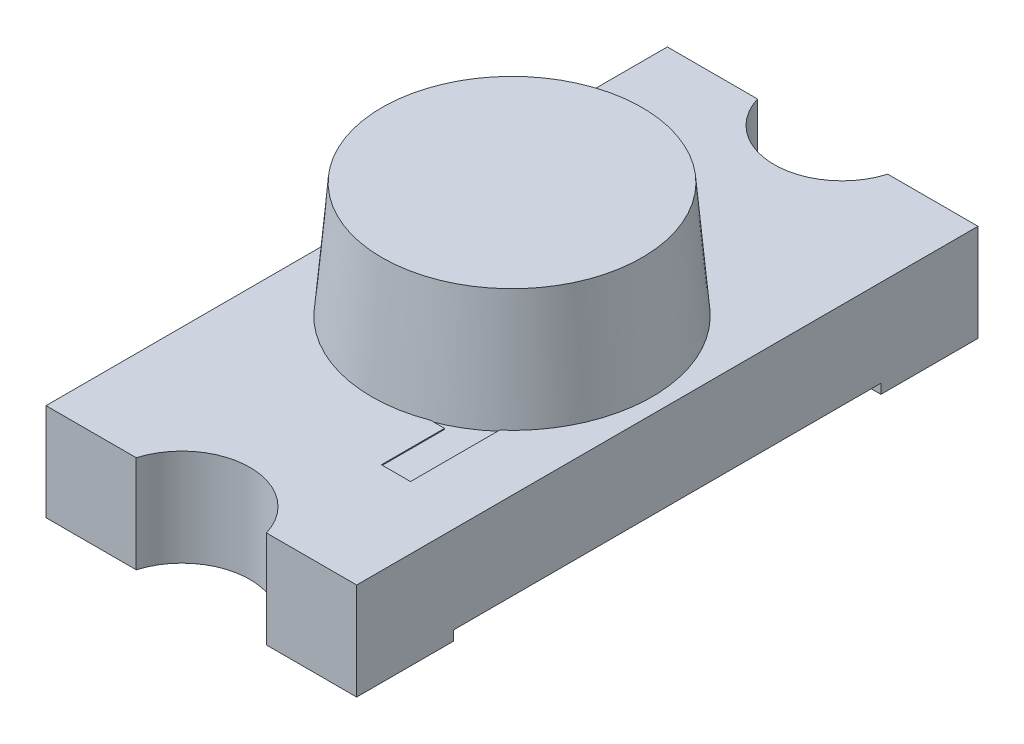
ISO-10303-21;
HEADER;
FILE_DESCRIPTION(('STEP AP214'),'2;1');
FILE_NAME('part.step','',(''),(''),'','','');
FILE_SCHEMA(('AUTOMOTIVE_DESIGN { 1 0 10303 214 1 1 1 1 }'));
ENDSEC;
DATA;
#1=APPLICATION_CONTEXT('core data for automotive mechanical design processes');
#2=APPLICATION_PROTOCOL_DEFINITION('international standard','automotive_design',2000,#1);
#3=PRODUCT_CONTEXT('',#1,'mechanical');
#4=PRODUCT('Part','Part','',(#3));
#5=PRODUCT_RELATED_PRODUCT_CATEGORY('part','',(#4));
#6=PRODUCT_DEFINITION_FORMATION('','',#4);
#7=PRODUCT_DEFINITION_CONTEXT('part definition',#1,'design');
#8=PRODUCT_DEFINITION('design','',#6,#7);
#9=PRODUCT_DEFINITION_SHAPE('','',#8);
#10=(LENGTH_UNIT() NAMED_UNIT(*) SI_UNIT(.MILLI.,.METRE.));
#11=(NAMED_UNIT(*) PLANE_ANGLE_UNIT() SI_UNIT($,.RADIAN.));
#12=(NAMED_UNIT(*) SI_UNIT($,.STERADIAN.) SOLID_ANGLE_UNIT());
#13=UNCERTAINTY_MEASURE_WITH_UNIT(LENGTH_MEASURE(1.E-05),#10,'distance_accuracy_value','');
#14=(GEOMETRIC_REPRESENTATION_CONTEXT(3) GLOBAL_UNCERTAINTY_ASSIGNED_CONTEXT((#13)) GLOBAL_UNIT_ASSIGNED_CONTEXT((#10,
#11,#12)) REPRESENTATION_CONTEXT('',''));
#15=CARTESIAN_POINT('',(0.,0.,0.));
#16=DIRECTION('',(0.,0.,1.));
#17=DIRECTION('',(1.,0.,0.));
#18=AXIS2_PLACEMENT_3D('',#15,#16,#17);
#19=CARTESIAN_POINT('',(0.,0.495,0.));
#20=DIRECTION('',(0.,-1.,0.));
#21=DIRECTION('',(0.,0.,1.));
#22=AXIS2_PLACEMENT_3D('',#19,#20,#21);
#23=CONICAL_SURFACE('',#22,0.722303878658216,0.0872664625997167);
#24=CARTESIAN_POINT('',(0.,1.095,0.));
#25=DIRECTION('',(0.,1.,0.));
#26=DIRECTION('',(0.,0.,1.));
#27=AXIS2_PLACEMENT_3D('',#24,#25,#26);
#28=CIRCLE('',#27,0.669810680542662);
#29=CARTESIAN_POINT('',(0.,1.095,0.669810680542662));
#30=VERTEX_POINT('',#29);
#31=EDGE_CURVE('E12',#30,#30,#28,.T.);
#32=ORIENTED_EDGE('',*,*,#31,.F.);
#33=EDGE_LOOP('',(#32));
#34=FACE_BOUND('',#33,.T.);
#35=CARTESIAN_POINT('',(0.,0.495,0.));
#36=DIRECTION('',(0.,1.,0.));
#37=DIRECTION('',(0.,0.,1.));
#38=AXIS2_PLACEMENT_3D('',#35,#36,#37);
#39=CIRCLE('',#38,0.722303878658216);
#40=CARTESIAN_POINT('',(0.,0.495,0.722303878658216));
#41=VERTEX_POINT('',#40);
#42=EDGE_CURVE('E52',#41,#41,#39,.T.);
#43=ORIENTED_EDGE('',*,*,#42,.T.);
#44=EDGE_LOOP('',(#43));
#45=FACE_BOUND('',#44,.T.);
#46=ADVANCED_FACE('F46',(#34,#45),#23,.T.);
#47=CARTESIAN_POINT('',(0.,1.095,0.));
#48=DIRECTION('',(0.,1.,0.));
#49=DIRECTION('',(0.,0.,1.));
#50=AXIS2_PLACEMENT_3D('',#47,#48,#49);
#51=PLANE('',#50);
#52=ORIENTED_EDGE('',*,*,#31,.T.);
#53=EDGE_LOOP('',(#52));
#54=FACE_BOUND('',#53,.T.);
#55=ADVANCED_FACE('F61',(#54),#51,.T.);
#56=CARTESIAN_POINT('',(0.,0.495,0.));
#57=DIRECTION('',(0.,1.,0.));
#58=DIRECTION('',(0.,0.,1.));
#59=AXIS2_PLACEMENT_3D('',#56,#57,#58);
#60=PLANE('',#59);
#61=ORIENTED_EDGE('',*,*,#42,.F.);
#62=EDGE_LOOP('',(#61));
#63=FACE_BOUND('',#62,.T.);
#64=ADVANCED_FACE('F59',(#63),#60,.F.);
#65=CLOSED_SHELL('',(#46,#55,#64));
#66=MANIFOLD_SOLID_BREP('B2',#65);
#67=CARTESIAN_POINT('',(-2.92422569718548,0.495,0.));
#68=DIRECTION('',(0.,1.,0.));
#69=DIRECTION('',(0.,0.,1.));
#70=AXIS2_PLACEMENT_3D('',#67,#68,#69);
#71=PLANE('',#70);
#72=DIRECTION('',(0.,0.,1.));
#73=VECTOR('',#72,1.);
#74=CARTESIAN_POINT('',(0.477379024541812,0.495,0.));
#75=LINE('',#74,#73);
#76=CARTESIAN_POINT('',(0.477379024541812,0.495,0.525));
#77=VERTEX_POINT('',#76);
#78=CARTESIAN_POINT('',(0.477379024541812,0.495,1.));
#79=VERTEX_POINT('',#78);
#80=EDGE_CURVE('E368',#77,#79,#75,.T.);
#81=ORIENTED_EDGE('',*,*,#80,.F.);
#82=DIRECTION('',(1.,0.,0.));
#83=VECTOR('',#82,1.);
#84=CARTESIAN_POINT('',(-2.92422569718548,0.495,0.525));
#85=LINE('',#84,#83);
#86=CARTESIAN_POINT('',(-0.075,0.495,0.525));
#87=VERTEX_POINT('',#86);
#88=EDGE_CURVE('E370',#87,#77,#85,.T.);
#89=ORIENTED_EDGE('',*,*,#88,.F.);
#90=DIRECTION('',(0.,0.,1.));
#91=VECTOR('',#90,1.);
#92=CARTESIAN_POINT('',(-0.075,0.495,0.));
#93=LINE('',#92,#91);
#94=CARTESIAN_POINT('',(-0.075,0.495,0.225));
#95=VERTEX_POINT('',#94);
#96=EDGE_CURVE('E373',#95,#87,#93,.T.);
#97=ORIENTED_EDGE('',*,*,#96,.F.);
#98=DIRECTION('',(1.,0.,0.));
#99=VECTOR('',#98,1.);
#100=CARTESIAN_POINT('',(-2.92422569718548,0.495,0.225000000000001));
#101=LINE('',#100,#99);
#102=CARTESIAN_POINT('',(0.225,0.495,0.225));
#103=VERTEX_POINT('',#102);
#104=EDGE_CURVE('E375',#95,#103,#101,.T.);
#105=ORIENTED_EDGE('',*,*,#104,.T.);
#106=DIRECTION('',(0.,0.,1.));
#107=VECTOR('',#106,1.);
#108=CARTESIAN_POINT('',(0.225,0.495,0.));
#109=LINE('',#108,#107);
#110=CARTESIAN_POINT('',(0.225,0.495,-0.225));
#111=VERTEX_POINT('',#110);
#112=EDGE_CURVE('E378',#111,#103,#109,.T.);
#113=ORIENTED_EDGE('',*,*,#112,.F.);
#114=DIRECTION('',(1.,0.,0.));
#115=VECTOR('',#114,1.);
#116=CARTESIAN_POINT('',(-2.92422569718548,0.495,-0.225));
#117=LINE('',#116,#115);
#118=CARTESIAN_POINT('',(-0.225,0.495,-0.225));
#119=VERTEX_POINT('',#118);
#120=EDGE_CURVE('E380',#119,#111,#117,.T.);
#121=ORIENTED_EDGE('',*,*,#120,.F.);
#122=DIRECTION('',(0.,0.,1.));
#123=VECTOR('',#122,1.);
#124=CARTESIAN_POINT('',(-0.225,0.495,0.));
#125=LINE('',#124,#123);
#126=CARTESIAN_POINT('',(-0.225,0.495,0.675));
#127=VERTEX_POINT('',#126);
#128=EDGE_CURVE('E382',#119,#127,#125,.T.);
#129=ORIENTED_EDGE('',*,*,#128,.T.);
#130=DIRECTION('',(1.,0.,0.));
#131=VECTOR('',#130,1.);
#132=CARTESIAN_POINT('',(-2.92422569718548,0.495,0.675));
#133=LINE('',#132,#131);
#134=CARTESIAN_POINT('',(0.327379024541811,0.495,0.675));
#135=VERTEX_POINT('',#134);
#136=EDGE_CURVE('E385',#127,#135,#133,.T.);
#137=ORIENTED_EDGE('',*,*,#136,.T.);
#138=DIRECTION('',(0.,0.,1.));
#139=VECTOR('',#138,1.);
#140=CARTESIAN_POINT('',(0.327379024541812,0.495,0.));
#141=LINE('',#140,#139);
#142=CARTESIAN_POINT('',(0.327379024541812,0.495,1.));
#143=VERTEX_POINT('',#142);
#144=EDGE_CURVE('E388',#135,#143,#141,.T.);
#145=ORIENTED_EDGE('',*,*,#144,.T.);
#146=DIRECTION('',(1.,0.,0.));
#147=VECTOR('',#146,1.);
#148=CARTESIAN_POINT('',(-2.92422569718548,0.495,1.));
#149=LINE('',#148,#147);
#150=EDGE_CURVE('E391',#143,#79,#149,.T.);
#151=ORIENTED_EDGE('',*,*,#150,.T.);
#152=EDGE_LOOP('',(#81,#89,#97,#105,#113,#121,#129,#137,#145,#151));
#153=FACE_BOUND('',#152,.T.);
#154=DIRECTION('',(1.,0.,0.));
#155=VECTOR('',#154,1.);
#156=CARTESIAN_POINT('',(-0.195,0.495,0.195));
#157=LINE('',#156,#155);
#158=CARTESIAN_POINT('',(-0.195,0.495,0.195));
#159=VERTEX_POINT('',#158);
#160=CARTESIAN_POINT('',(0.195,0.495,0.195));
#161=VERTEX_POINT('',#160);
#162=EDGE_CURVE('E963',#159,#161,#157,.T.);
#163=ORIENTED_EDGE('',*,*,#162,.F.);
#164=DIRECTION('',(0.,0.,1.));
#165=VECTOR('',#164,1.);
#166=CARTESIAN_POINT('',(-0.195,0.495,-0.195));
#167=LINE('',#166,#165);
#168=CARTESIAN_POINT('',(-0.195,0.495,-0.195));
#169=VERTEX_POINT('',#168);
#170=EDGE_CURVE('E318',#169,#159,#167,.T.);
#171=ORIENTED_EDGE('',*,*,#170,.F.);
#172=DIRECTION('',(-1.,0.,0.));
#173=VECTOR('',#172,1.);
#174=CARTESIAN_POINT('',(-0.195,0.495,-0.195));
#175=LINE('',#174,#173);
#176=CARTESIAN_POINT('',(0.195,0.495,-0.195));
#177=VERTEX_POINT('',#176);
#178=EDGE_CURVE('E314',#177,#169,#175,.T.);
#179=ORIENTED_EDGE('',*,*,#178,.F.);
#180=DIRECTION('',(0.,0.,-1.));
#181=VECTOR('',#180,1.);
#182=CARTESIAN_POINT('',(0.195,0.495,-0.195));
#183=LINE('',#182,#181);
#184=EDGE_CURVE('E960',#161,#177,#183,.T.);
#185=ORIENTED_EDGE('',*,*,#184,.F.);
#186=EDGE_LOOP('',(#163,#171,#179,#185));
#187=FACE_BOUND('',#186,.T.);
#188=ADVANCED_FACE('F87',(#153,#187),#71,.T.);
#189=CARTESIAN_POINT('',(0.8,0.5,1.6));
#190=DIRECTION('',(0.,-1.,0.));
#191=DIRECTION('',(0.,0.,-1.));
#192=AXIS2_PLACEMENT_3D('',#189,#190,#191);
#193=PLANE('',#192);
#194=DIRECTION('',(0.,0.,-1.));
#195=VECTOR('',#194,1.);
#196=CARTESIAN_POINT('',(0.276447509101705,0.5,0.));
#197=LINE('',#196,#195);
#198=CARTESIAN_POINT('',(0.276447509101705,0.5,-0.450698671652405));
#199=VERTEX_POINT('',#198);
#200=CARTESIAN_POINT('',(0.276447509101705,0.5,-0.630698671652405));
#201=VERTEX_POINT('',#200);
#202=EDGE_CURVE('E321',#199,#201,#197,.T.);
#203=ORIENTED_EDGE('',*,*,#202,.F.);
#204=DIRECTION('',(1.,0.,0.));
#205=VECTOR('',#204,1.);
#206=CARTESIAN_POINT('',(-2.92422569718548,0.5,-0.450698671652405));
#207=LINE('',#206,#205);
#208=CARTESIAN_POINT('',(-0.457414609839892,0.5,-0.450698671652405));
#209=VERTEX_POINT('',#208);
#210=EDGE_CURVE('E110',#209,#199,#207,.T.);
#211=ORIENTED_EDGE('',*,*,#210,.F.);
#212=DIRECTION('',(0.,0.,1.));
#213=VECTOR('',#212,1.);
#214=CARTESIAN_POINT('',(-0.457414609839892,0.5,0.));
#215=LINE('',#214,#213);
#216=CARTESIAN_POINT('',(-0.457414609839892,0.5,-1.));
#217=VERTEX_POINT('',#216);
#218=EDGE_CURVE('E330',#217,#209,#215,.T.);
#219=ORIENTED_EDGE('',*,*,#218,.F.);
#220=DIRECTION('',(1.,0.,0.));
#221=VECTOR('',#220,1.);
#222=CARTESIAN_POINT('',(-2.92422569718548,0.5,-1.));
#223=LINE('',#222,#221);
#224=CARTESIAN_POINT('',(-0.277414609839892,0.5,-1.));
#225=VERTEX_POINT('',#224);
#226=EDGE_CURVE('E351',#217,#225,#223,.T.);
#227=ORIENTED_EDGE('',*,*,#226,.T.);
#228=DIRECTION('',(0.,0.,1.));
#229=VECTOR('',#228,1.);
#230=CARTESIAN_POINT('',(-0.277414609839892,0.5,0.));
#231=LINE('',#230,#229);
#232=CARTESIAN_POINT('',(-0.277414609839892,0.5,-0.630698671652405));
#233=VERTEX_POINT('',#232);
#234=EDGE_CURVE('E348',#225,#233,#231,.T.);
#235=ORIENTED_EDGE('',*,*,#234,.T.);
#236=DIRECTION('',(1.,0.,0.));
#237=VECTOR('',#236,1.);
#238=CARTESIAN_POINT('',(-2.92422569718548,0.5,-0.630698671652405));
#239=LINE('',#238,#237);
#240=EDGE_CURVE('E345',#233,#201,#239,.T.);
#241=ORIENTED_EDGE('',*,*,#240,.T.);
#242=EDGE_LOOP('',(#203,#211,#219,#227,#235,#241));
#243=FACE_BOUND('',#242,.T.);
#244=CARTESIAN_POINT('',(0.,0.500000000000001,1.7));
#245=DIRECTION('',(0.,1.,0.));
#246=DIRECTION('',(0.,0.,1.));
#247=AXIS2_PLACEMENT_3D('',#244,#245,#246);
#248=CIRCLE('',#247,0.35);
#249=CARTESIAN_POINT('',(0.335410196624969,0.500000000000001,1.6));
#250=VERTEX_POINT('',#249);
#251=CARTESIAN_POINT('',(-0.335410196624969,0.500000000000001,1.6));
#252=VERTEX_POINT('',#251);
#253=EDGE_CURVE('E444',#250,#252,#248,.T.);
#254=ORIENTED_EDGE('',*,*,#253,.F.);
#255=DIRECTION('',(-1.,0.,0.));
#256=VECTOR('',#255,1.);
#257=CARTESIAN_POINT('',(0.8,0.5,1.6));
#258=LINE('',#257,#256);
#259=CARTESIAN_POINT('',(0.8,0.5,1.6));
#260=VERTEX_POINT('',#259);
#261=EDGE_CURVE('E501',#260,#250,#258,.T.);
#262=ORIENTED_EDGE('',*,*,#261,.F.);
#263=DIRECTION('',(0.,0.,1.));
#264=VECTOR('',#263,1.);
#265=CARTESIAN_POINT('',(0.8,0.5,1.6));
#266=LINE('',#265,#264);
#267=CARTESIAN_POINT('',(0.8,0.500000000000001,-1.6));
#268=VERTEX_POINT('',#267);
#269=EDGE_CURVE('E498',#268,#260,#266,.T.);
#270=ORIENTED_EDGE('',*,*,#269,.F.);
#271=DIRECTION('',(-1.,0.,0.));
#272=VECTOR('',#271,1.);
#273=CARTESIAN_POINT('',(0.8,0.500000000000001,-1.6));
#274=LINE('',#273,#272);
#275=CARTESIAN_POINT('',(0.335410196624969,0.500000000000001,-1.6));
#276=VERTEX_POINT('',#275);
#277=EDGE_CURVE('E505',#268,#276,#274,.T.);
#278=ORIENTED_EDGE('',*,*,#277,.T.);
#279=CARTESIAN_POINT('',(0.,0.500000000000001,-1.7));
#280=DIRECTION('',(0.,-1.,0.));
#281=DIRECTION('',(0.,0.,-1.));
#282=AXIS2_PLACEMENT_3D('',#279,#280,#281);
#283=CIRCLE('',#282,0.35);
#284=CARTESIAN_POINT('',(-0.335410196624969,0.500000000000001,-1.6));
#285=VERTEX_POINT('',#284);
#286=EDGE_CURVE('E44',#285,#276,#283,.F.);
#287=ORIENTED_EDGE('',*,*,#286,.F.);
#288=CARTESIAN_POINT('',(-0.8,0.500000000000001,-1.6));
#289=VERTEX_POINT('',#288);
#290=EDGE_CURVE('E504',#285,#289,#274,.T.);
#291=ORIENTED_EDGE('',*,*,#290,.T.);
#292=DIRECTION('',(0.,0.,1.));
#293=VECTOR('',#292,1.);
#294=CARTESIAN_POINT('',(-0.8,0.5,1.6));
#295=LINE('',#294,#293);
#296=CARTESIAN_POINT('',(-0.8,0.5,1.6));
#297=VERTEX_POINT('',#296);
#298=EDGE_CURVE('E480',#289,#297,#295,.T.);
#299=ORIENTED_EDGE('',*,*,#298,.T.);
#300=EDGE_CURVE('E500',#252,#297,#258,.T.);
#301=ORIENTED_EDGE('',*,*,#300,.F.);
#302=EDGE_LOOP('',(#254,#262,#270,#278,#287,#291,#299,#301));
#303=FACE_BOUND('',#302,.T.);
#304=DIRECTION('',(0.,0.,1.));
#305=VECTOR('',#304,1.);
#306=CARTESIAN_POINT('',(0.477379024541812,0.5,0.));
#307=LINE('',#306,#305);
#308=CARTESIAN_POINT('',(0.477379024541812,0.5,0.525));
#309=VERTEX_POINT('',#308);
#310=CARTESIAN_POINT('',(0.477379024541812,0.5,1.));
#311=VERTEX_POINT('',#310);
#312=EDGE_CURVE('E358',#309,#311,#307,.T.);
#313=ORIENTED_EDGE('',*,*,#312,.T.);
#314=DIRECTION('',(1.,0.,0.));
#315=VECTOR('',#314,1.);
#316=CARTESIAN_POINT('',(-2.92422569718548,0.5,1.));
#317=LINE('',#316,#315);
#318=CARTESIAN_POINT('',(0.327379024541812,0.5,1.));
#319=VERTEX_POINT('',#318);
#320=EDGE_CURVE('E371',#319,#311,#317,.T.);
#321=ORIENTED_EDGE('',*,*,#320,.F.);
#322=DIRECTION('',(0.,0.,1.));
#323=VECTOR('',#322,1.);
#324=CARTESIAN_POINT('',(0.327379024541812,0.5,0.));
#325=LINE('',#324,#323);
#326=CARTESIAN_POINT('',(0.327379024541811,0.5,0.675));
#327=VERTEX_POINT('',#326);
#328=EDGE_CURVE('E418',#327,#319,#325,.T.);
#329=ORIENTED_EDGE('',*,*,#328,.F.);
#330=DIRECTION('',(1.,0.,0.));
#331=VECTOR('',#330,1.);
#332=CARTESIAN_POINT('',(-2.92422569718548,0.5,0.675));
#333=LINE('',#332,#331);
#334=CARTESIAN_POINT('',(-0.225,0.5,0.675));
#335=VERTEX_POINT('',#334);
#336=EDGE_CURVE('E415',#335,#327,#333,.T.);
#337=ORIENTED_EDGE('',*,*,#336,.F.);
#338=DIRECTION('',(0.,0.,1.));
#339=VECTOR('',#338,1.);
#340=CARTESIAN_POINT('',(-0.225,0.5,0.));
#341=LINE('',#340,#339);
#342=CARTESIAN_POINT('',(-0.225,0.5,-0.225));
#343=VERTEX_POINT('',#342);
#344=EDGE_CURVE('E412',#343,#335,#341,.T.);
#345=ORIENTED_EDGE('',*,*,#344,.F.);
#346=DIRECTION('',(1.,0.,0.));
#347=VECTOR('',#346,1.);
#348=CARTESIAN_POINT('',(-2.92422569718548,0.5,-0.225));
#349=LINE('',#348,#347);
#350=CARTESIAN_POINT('',(0.225,0.5,-0.225));
#351=VERTEX_POINT('',#350);
#352=EDGE_CURVE('E409',#343,#351,#349,.T.);
#353=ORIENTED_EDGE('',*,*,#352,.T.);
#354=DIRECTION('',(0.,0.,1.));
#355=VECTOR('',#354,1.);
#356=CARTESIAN_POINT('',(0.225,0.5,0.));
#357=LINE('',#356,#355);
#358=CARTESIAN_POINT('',(0.225,0.5,0.225));
#359=VERTEX_POINT('',#358);
#360=EDGE_CURVE('E406',#351,#359,#357,.T.);
#361=ORIENTED_EDGE('',*,*,#360,.T.);
#362=DIRECTION('',(1.,0.,0.));
#363=VECTOR('',#362,1.);
#364=CARTESIAN_POINT('',(-2.92422569718548,0.5,0.225000000000001));
#365=LINE('',#364,#363);
#366=CARTESIAN_POINT('',(-0.075,0.5,0.225));
#367=VERTEX_POINT('',#366);
#368=EDGE_CURVE('E403',#367,#359,#365,.T.);
#369=ORIENTED_EDGE('',*,*,#368,.F.);
#370=DIRECTION('',(0.,0.,1.));
#371=VECTOR('',#370,1.);
#372=CARTESIAN_POINT('',(-0.075,0.5,0.));
#373=LINE('',#372,#371);
#374=CARTESIAN_POINT('',(-0.075,0.5,0.525));
#375=VERTEX_POINT('',#374);
#376=EDGE_CURVE('E400',#367,#375,#373,.T.);
#377=ORIENTED_EDGE('',*,*,#376,.T.);
#378=DIRECTION('',(1.,0.,0.));
#379=VECTOR('',#378,1.);
#380=CARTESIAN_POINT('',(-2.92422569718548,0.5,0.525));
#381=LINE('',#380,#379);
#382=EDGE_CURVE('E397',#375,#309,#381,.T.);
#383=ORIENTED_EDGE('',*,*,#382,.T.);
#384=EDGE_LOOP('',(#313,#321,#329,#337,#345,#353,#361,#369,#377,#383));
#385=FACE_BOUND('',#384,.T.);
#386=ADVANCED_FACE('F539',(#243,#303,#385),#193,.F.);
#387=CARTESIAN_POINT('',(0.8,0.5,1.6));
#388=DIRECTION('',(0.,0.,-1.));
#389=DIRECTION('',(0.,1.,0.));
#390=AXIS2_PLACEMENT_3D('',#387,#388,#389);
#391=PLANE('',#390);
#392=DIRECTION('',(0.,-1.,0.));
#393=VECTOR('',#392,1.);
#394=CARTESIAN_POINT('',(0.335410196624969,0.500000000000001,1.6));
#395=LINE('',#394,#393);
#396=CARTESIAN_POINT('',(0.335410196624969,0.,1.6));
#397=VERTEX_POINT('',#396);
#398=EDGE_CURVE('E450',#397,#250,#395,.F.);
#399=ORIENTED_EDGE('',*,*,#398,.F.);
#400=DIRECTION('',(-1.,0.,0.));
#401=VECTOR('',#400,1.);
#402=CARTESIAN_POINT('',(0.8,0.,1.6));
#403=LINE('',#402,#401);
#404=CARTESIAN_POINT('',(0.8,0.,1.6));
#405=VERTEX_POINT('',#404);
#406=EDGE_CURVE('E95',#405,#397,#403,.T.);
#407=ORIENTED_EDGE('',*,*,#406,.F.);
#408=DIRECTION('',(0.,-1.,0.));
#409=VECTOR('',#408,1.);
#410=CARTESIAN_POINT('',(0.8,0.5,1.6));
#411=LINE('',#410,#409);
#412=EDGE_CURVE('E483',#260,#405,#411,.T.);
#413=ORIENTED_EDGE('',*,*,#412,.F.);
#414=ORIENTED_EDGE('',*,*,#261,.T.);
#415=EDGE_LOOP('',(#399,#407,#413,#414));
#416=FACE_BOUND('',#415,.T.);
#417=ADVANCED_FACE('F89',(#416),#391,.F.);
#418=DIRECTION('',(0.,-1.,0.));
#419=VECTOR('',#418,1.);
#420=CARTESIAN_POINT('',(-0.335410196624969,0.500000000000001,1.6));
#421=LINE('',#420,#419);
#422=CARTESIAN_POINT('',(-0.335410196624969,0.,1.6));
#423=VERTEX_POINT('',#422);
#424=EDGE_CURVE('E446',#252,#423,#421,.T.);
#425=ORIENTED_EDGE('',*,*,#424,.F.);
#426=ORIENTED_EDGE('',*,*,#300,.T.);
#427=DIRECTION('',(0.,-1.,0.));
#428=VECTOR('',#427,1.);
#429=CARTESIAN_POINT('',(-0.8,0.5,1.6));
#430=LINE('',#429,#428);
#431=CARTESIAN_POINT('',(-0.8,0.,1.6));
#432=VERTEX_POINT('',#431);
#433=EDGE_CURVE('E459',#297,#432,#430,.T.);
#434=ORIENTED_EDGE('',*,*,#433,.T.);
#435=EDGE_CURVE('E519',#423,#432,#403,.T.);
#436=ORIENTED_EDGE('',*,*,#435,.F.);
#437=EDGE_LOOP('',(#425,#426,#434,#436));
#438=FACE_BOUND('',#437,.T.);
#439=ADVANCED_FACE('F535',(#438),#391,.F.);
#440=CARTESIAN_POINT('',(0.8,0.,1.6));
#441=DIRECTION('',(0.,1.,0.));
#442=DIRECTION('',(0.,0.,1.));
#443=AXIS2_PLACEMENT_3D('',#440,#441,#442);
#444=PLANE('',#443);
#445=CARTESIAN_POINT('',(0.,0.,1.7));
#446=DIRECTION('',(0.,1.,0.));
#447=DIRECTION('',(0.,0.,1.));
#448=AXIS2_PLACEMENT_3D('',#445,#446,#447);
#449=CIRCLE('',#448,0.35);
#450=EDGE_CURVE('E425',#397,#423,#449,.T.);
#451=ORIENTED_EDGE('',*,*,#450,.T.);
#452=ORIENTED_EDGE('',*,*,#435,.T.);
#453=DIRECTION('',(0.,0.,-1.));
#454=VECTOR('',#453,1.);
#455=CARTESIAN_POINT('',(-0.8,0.,1.6));
#456=LINE('',#455,#454);
#457=CARTESIAN_POINT('',(-0.8,0.,1.1));
#458=VERTEX_POINT('',#457);
#459=EDGE_CURVE('E462',#432,#458,#456,.T.);
#460=ORIENTED_EDGE('',*,*,#459,.T.);
#461=DIRECTION('',(-1.,0.,0.));
#462=VECTOR('',#461,1.);
#463=CARTESIAN_POINT('',(0.8,0.,1.1));
#464=LINE('',#463,#462);
#465=CARTESIAN_POINT('',(0.8,0.,1.1));
#466=VERTEX_POINT('',#465);
#467=EDGE_CURVE('E518',#466,#458,#464,.T.);
#468=ORIENTED_EDGE('',*,*,#467,.F.);
#469=DIRECTION('',(0.,0.,-1.));
#470=VECTOR('',#469,1.);
#471=CARTESIAN_POINT('',(0.8,0.,1.6));
#472=LINE('',#471,#470);
#473=EDGE_CURVE('E486',#405,#466,#472,.T.);
#474=ORIENTED_EDGE('',*,*,#473,.F.);
#475=ORIENTED_EDGE('',*,*,#406,.T.);
#476=EDGE_LOOP('',(#451,#452,#460,#468,#474,#475));
#477=FACE_BOUND('',#476,.T.);
#478=ADVANCED_FACE('F525',(#477),#444,.F.);
#479=CARTESIAN_POINT('',(0.8,0.,-1.1));
#480=DIRECTION('',(0.,1.,0.));
#481=DIRECTION('',(0.,0.,1.));
#482=AXIS2_PLACEMENT_3D('',#479,#480,#481);
#483=PLANE('',#482);
#484=CARTESIAN_POINT('',(0.,0.,-1.7));
#485=DIRECTION('',(0.,1.,0.));
#486=DIRECTION('',(0.,0.,1.));
#487=AXIS2_PLACEMENT_3D('',#484,#485,#486);
#488=CIRCLE('',#487,0.35);
#489=CARTESIAN_POINT('',(-0.335410196624969,0.,-1.6));
#490=VERTEX_POINT('',#489);
#491=CARTESIAN_POINT('',(0.335410196624969,0.,-1.6));
#492=VERTEX_POINT('',#491);
#493=EDGE_CURVE('E452',#490,#492,#488,.T.);
#494=ORIENTED_EDGE('',*,*,#493,.T.);
#495=DIRECTION('',(-1.,0.,0.));
#496=VECTOR('',#495,1.);
#497=CARTESIAN_POINT('',(0.8,0.,-1.6));
#498=LINE('',#497,#496);
#499=CARTESIAN_POINT('',(0.8,0.,-1.6));
#500=VERTEX_POINT('',#499);
#501=EDGE_CURVE('E509',#500,#492,#498,.T.);
#502=ORIENTED_EDGE('',*,*,#501,.F.);
#503=DIRECTION('',(0.,0.,-1.));
#504=VECTOR('',#503,1.);
#505=CARTESIAN_POINT('',(0.8,0.,-1.1));
#506=LINE('',#505,#504);
#507=CARTESIAN_POINT('',(0.8,0.,-1.1));
#508=VERTEX_POINT('',#507);
#509=EDGE_CURVE('E494',#508,#500,#506,.T.);
#510=ORIENTED_EDGE('',*,*,#509,.F.);
#511=DIRECTION('',(-1.,0.,0.));
#512=VECTOR('',#511,1.);
#513=CARTESIAN_POINT('',(0.8,0.,-1.1));
#514=LINE('',#513,#512);
#515=CARTESIAN_POINT('',(-0.8,0.,-1.1));
#516=VERTEX_POINT('',#515);
#517=EDGE_CURVE('E512',#508,#516,#514,.T.);
#518=ORIENTED_EDGE('',*,*,#517,.T.);
#519=DIRECTION('',(0.,0.,-1.));
#520=VECTOR('',#519,1.);
#521=CARTESIAN_POINT('',(-0.8,0.,-1.1));
#522=LINE('',#521,#520);
#523=CARTESIAN_POINT('',(-0.8,0.,-1.6));
#524=VERTEX_POINT('',#523);
#525=EDGE_CURVE('E474',#516,#524,#522,.T.);
#526=ORIENTED_EDGE('',*,*,#525,.T.);
#527=EDGE_CURVE('E508',#490,#524,#498,.T.);
#528=ORIENTED_EDGE('',*,*,#527,.F.);
#529=EDGE_LOOP('',(#494,#502,#510,#518,#526,#528));
#530=FACE_BOUND('',#529,.T.);
#531=ADVANCED_FACE('F550',(#530),#483,.F.);
#532=CARTESIAN_POINT('',(0.8,0.500000000000001,-1.6));
#533=DIRECTION('',(0.,0.,1.));
#534=DIRECTION('',(0.,-1.,0.));
#535=AXIS2_PLACEMENT_3D('',#532,#533,#534);
#536=PLANE('',#535);
#537=DIRECTION('',(0.,-1.,0.));
#538=VECTOR('',#537,1.);
#539=CARTESIAN_POINT('',(-0.335410196624969,0.500000000000001,-1.6));
#540=LINE('',#539,#538);
#541=EDGE_CURVE('E457',#490,#285,#540,.F.);
#542=ORIENTED_EDGE('',*,*,#541,.F.);
#543=ORIENTED_EDGE('',*,*,#527,.T.);
#544=DIRECTION('',(0.,1.,0.));
#545=VECTOR('',#544,1.);
#546=CARTESIAN_POINT('',(-0.8,0.500000000000001,-1.6));
#547=LINE('',#546,#545);
#548=EDGE_CURVE('E477',#524,#289,#547,.T.);
#549=ORIENTED_EDGE('',*,*,#548,.T.);
#550=ORIENTED_EDGE('',*,*,#290,.F.);
#551=EDGE_LOOP('',(#542,#543,#549,#550));
#552=FACE_BOUND('',#551,.T.);
#553=ADVANCED_FACE('F865',(#552),#536,.F.);
#554=DIRECTION('',(0.,-1.,0.));
#555=VECTOR('',#554,1.);
#556=CARTESIAN_POINT('',(0.335410196624969,0.500000000000001,-1.6));
#557=LINE('',#556,#555);
#558=EDGE_CURVE('E455',#276,#492,#557,.T.);
#559=ORIENTED_EDGE('',*,*,#558,.F.);
#560=ORIENTED_EDGE('',*,*,#277,.F.);
#561=DIRECTION('',(0.,1.,0.));
#562=VECTOR('',#561,1.);
#563=CARTESIAN_POINT('',(0.8,0.500000000000001,-1.6));
#564=LINE('',#563,#562);
#565=EDGE_CURVE('E496',#500,#268,#564,.T.);
#566=ORIENTED_EDGE('',*,*,#565,.F.);
#567=ORIENTED_EDGE('',*,*,#501,.T.);
#568=EDGE_LOOP('',(#559,#560,#566,#567));
#569=FACE_BOUND('',#568,.T.);
#570=ADVANCED_FACE('F860',(#569),#536,.F.);
#571=CARTESIAN_POINT('',(0.8,0.0500000000000005,1.1));
#572=DIRECTION('',(0.,0.,1.));
#573=DIRECTION('',(1.,0.,0.));
#574=AXIS2_PLACEMENT_3D('',#571,#572,#573);
#575=PLANE('',#574);
#576=ORIENTED_EDGE('',*,*,#467,.T.);
#577=DIRECTION('',(0.,1.,0.));
#578=VECTOR('',#577,1.);
#579=CARTESIAN_POINT('',(-0.8,0.0500000000000005,1.1));
#580=LINE('',#579,#578);
#581=CARTESIAN_POINT('',(-0.8,0.0500000000000005,1.1));
#582=VERTEX_POINT('',#581);
#583=EDGE_CURVE('E465',#458,#582,#580,.T.);
#584=ORIENTED_EDGE('',*,*,#583,.T.);
#585=DIRECTION('',(-1.,0.,0.));
#586=VECTOR('',#585,1.);
#587=CARTESIAN_POINT('',(0.8,0.0500000000000005,1.1));
#588=LINE('',#587,#586);
#589=CARTESIAN_POINT('',(0.8,0.0500000000000005,1.1));
#590=VERTEX_POINT('',#589);
#591=EDGE_CURVE('E516',#590,#582,#588,.T.);
#592=ORIENTED_EDGE('',*,*,#591,.F.);
#593=DIRECTION('',(0.,1.,0.));
#594=VECTOR('',#593,1.);
#595=CARTESIAN_POINT('',(0.8,0.0500000000000005,1.1));
#596=LINE('',#595,#594);
#597=EDGE_CURVE('E488',#466,#590,#596,.T.);
#598=ORIENTED_EDGE('',*,*,#597,.F.);
#599=EDGE_LOOP('',(#576,#584,#592,#598));
#600=FACE_BOUND('',#599,.T.);
#601=ADVANCED_FACE('F564',(#600),#575,.F.);
#602=CARTESIAN_POINT('',(0.8,0.0500000000000005,1.1));
#603=DIRECTION('',(0.,1.,0.));
#604=DIRECTION('',(0.,0.,1.));
#605=AXIS2_PLACEMENT_3D('',#602,#603,#604);
#606=PLANE('',#605);
#607=ORIENTED_EDGE('',*,*,#591,.T.);
#608=DIRECTION('',(0.,0.,-1.));
#609=VECTOR('',#608,1.);
#610=CARTESIAN_POINT('',(-0.8,0.0500000000000005,1.1));
#611=LINE('',#610,#609);
#612=CARTESIAN_POINT('',(-0.8,0.0500000000000005,-1.1));
#613=VERTEX_POINT('',#612);
#614=EDGE_CURVE('E468',#582,#613,#611,.T.);
#615=ORIENTED_EDGE('',*,*,#614,.T.);
#616=DIRECTION('',(-1.,0.,0.));
#617=VECTOR('',#616,1.);
#618=CARTESIAN_POINT('',(0.8,0.0500000000000005,-1.1));
#619=LINE('',#618,#617);
#620=CARTESIAN_POINT('',(0.8,0.0500000000000005,-1.1));
#621=VERTEX_POINT('',#620);
#622=EDGE_CURVE('E514',#621,#613,#619,.T.);
#623=ORIENTED_EDGE('',*,*,#622,.F.);
#624=DIRECTION('',(0.,0.,-1.));
#625=VECTOR('',#624,1.);
#626=CARTESIAN_POINT('',(0.8,0.0500000000000005,1.1));
#627=LINE('',#626,#625);
#628=EDGE_CURVE('E490',#590,#621,#627,.T.);
#629=ORIENTED_EDGE('',*,*,#628,.F.);
#630=EDGE_LOOP('',(#607,#615,#623,#629));
#631=FACE_BOUND('',#630,.T.);
#632=ADVANCED_FACE('F559',(#631),#606,.F.);
#633=CARTESIAN_POINT('',(0.8,0.0500000000000005,-1.1));
#634=DIRECTION('',(0.,0.,-1.));
#635=DIRECTION('',(-1.,0.,0.));
#636=AXIS2_PLACEMENT_3D('',#633,#634,#635);
#637=PLANE('',#636);
#638=ORIENTED_EDGE('',*,*,#622,.T.);
#639=DIRECTION('',(0.,-1.,0.));
#640=VECTOR('',#639,1.);
#641=CARTESIAN_POINT('',(-0.8,0.0500000000000005,-1.1));
#642=LINE('',#641,#640);
#643=EDGE_CURVE('E471',#613,#516,#642,.T.);
#644=ORIENTED_EDGE('',*,*,#643,.T.);
#645=ORIENTED_EDGE('',*,*,#517,.F.);
#646=DIRECTION('',(0.,-1.,0.));
#647=VECTOR('',#646,1.);
#648=CARTESIAN_POINT('',(0.8,0.0500000000000005,-1.1));
#649=LINE('',#648,#647);
#650=EDGE_CURVE('E492',#621,#508,#649,.T.);
#651=ORIENTED_EDGE('',*,*,#650,.F.);
#652=EDGE_LOOP('',(#638,#644,#645,#651));
#653=FACE_BOUND('',#652,.T.);
#654=ADVANCED_FACE('F556',(#653),#637,.F.);
#655=CARTESIAN_POINT('',(0.8,0.5,1.6));
#656=DIRECTION('',(1.,0.,0.));
#657=DIRECTION('',(0.,0.,-1.));
#658=AXIS2_PLACEMENT_3D('',#655,#656,#657);
#659=PLANE('',#658);
#660=ORIENTED_EDGE('',*,*,#412,.T.);
#661=ORIENTED_EDGE('',*,*,#473,.T.);
#662=ORIENTED_EDGE('',*,*,#597,.T.);
#663=ORIENTED_EDGE('',*,*,#628,.T.);
#664=ORIENTED_EDGE('',*,*,#650,.T.);
#665=ORIENTED_EDGE('',*,*,#509,.T.);
#666=ORIENTED_EDGE('',*,*,#565,.T.);
#667=ORIENTED_EDGE('',*,*,#269,.T.);
#668=EDGE_LOOP('',(#660,#661,#662,#663,#664,#665,#666,#667));
#669=FACE_BOUND('',#668,.T.);
#670=ADVANCED_FACE('F567',(#669),#659,.T.);
#671=CARTESIAN_POINT('',(-0.8,0.5,1.6));
#672=DIRECTION('',(1.,0.,0.));
#673=DIRECTION('',(0.,0.,-1.));
#674=AXIS2_PLACEMENT_3D('',#671,#672,#673);
#675=PLANE('',#674);
#676=ORIENTED_EDGE('',*,*,#433,.F.);
#677=ORIENTED_EDGE('',*,*,#298,.F.);
#678=ORIENTED_EDGE('',*,*,#548,.F.);
#679=ORIENTED_EDGE('',*,*,#525,.F.);
#680=ORIENTED_EDGE('',*,*,#643,.F.);
#681=ORIENTED_EDGE('',*,*,#614,.F.);
#682=ORIENTED_EDGE('',*,*,#583,.F.);
#683=ORIENTED_EDGE('',*,*,#459,.F.);
#684=EDGE_LOOP('',(#676,#677,#678,#679,#680,#681,#682,#683));
#685=FACE_BOUND('',#684,.T.);
#686=ADVANCED_FACE('F532',(#685),#675,.F.);
#687=CARTESIAN_POINT('',(0.,0.500000000000001,-1.7));
#688=DIRECTION('',(0.,-1.,0.));
#689=DIRECTION('',(0.,0.,-1.));
#690=AXIS2_PLACEMENT_3D('',#687,#688,#689);
#691=CYLINDRICAL_SURFACE('',#690,0.35);
#692=ORIENTED_EDGE('',*,*,#541,.T.);
#693=ORIENTED_EDGE('',*,*,#286,.T.);
#694=ORIENTED_EDGE('',*,*,#558,.T.);
#695=ORIENTED_EDGE('',*,*,#493,.F.);
#696=EDGE_LOOP('',(#692,#693,#694,#695));
#697=FACE_BOUND('',#696,.T.);
#698=ADVANCED_FACE('F575',(#697),#691,.F.);
#699=CARTESIAN_POINT('',(0.,0.500000000000001,1.7));
#700=DIRECTION('',(0.,-1.,0.));
#701=DIRECTION('',(0.,0.,-1.));
#702=AXIS2_PLACEMENT_3D('',#699,#700,#701);
#703=CYLINDRICAL_SURFACE('',#702,0.35);
#704=ORIENTED_EDGE('',*,*,#398,.T.);
#705=ORIENTED_EDGE('',*,*,#253,.T.);
#706=ORIENTED_EDGE('',*,*,#424,.T.);
#707=ORIENTED_EDGE('',*,*,#450,.F.);
#708=EDGE_LOOP('',(#704,#705,#706,#707));
#709=FACE_BOUND('',#708,.T.);
#710=ADVANCED_FACE('F572',(#709),#703,.F.);
#711=CARTESIAN_POINT('',(0.477379024541812,0.495,0.));
#712=DIRECTION('',(-1.,0.,0.));
#713=DIRECTION('',(0.,0.,1.));
#714=AXIS2_PLACEMENT_3D('',#711,#712,#713);
#715=PLANE('',#714);
#716=ORIENTED_EDGE('',*,*,#312,.F.);
#717=DIRECTION('',(0.,1.,0.));
#718=VECTOR('',#717,1.);
#719=CARTESIAN_POINT('',(0.477379024541812,0.495,0.525));
#720=LINE('',#719,#718);
#721=EDGE_CURVE('E394',#77,#309,#720,.T.);
#722=ORIENTED_EDGE('',*,*,#721,.F.);
#723=ORIENTED_EDGE('',*,*,#80,.T.);
#724=DIRECTION('',(0.,1.,0.));
#725=VECTOR('',#724,1.);
#726=CARTESIAN_POINT('',(0.477379024541812,0.495,1.));
#727=LINE('',#726,#725);
#728=EDGE_CURVE('E423',#79,#311,#727,.T.);
#729=ORIENTED_EDGE('',*,*,#728,.T.);
#730=EDGE_LOOP('',(#716,#722,#723,#729));
#731=FACE_BOUND('',#730,.T.);
#732=ADVANCED_FACE('F574',(#731),#715,.T.);
#733=CARTESIAN_POINT('',(-2.92422569718548,0.495,1.));
#734=DIRECTION('',(0.,0.,1.));
#735=DIRECTION('',(0.,-1.,0.));
#736=AXIS2_PLACEMENT_3D('',#733,#734,#735);
#737=PLANE('',#736);
#738=ORIENTED_EDGE('',*,*,#320,.T.);
#739=ORIENTED_EDGE('',*,*,#728,.F.);
#740=ORIENTED_EDGE('',*,*,#150,.F.);
#741=DIRECTION('',(0.,1.,0.));
#742=VECTOR('',#741,1.);
#743=CARTESIAN_POINT('',(0.327379024541812,0.495,1.));
#744=LINE('',#743,#742);
#745=EDGE_CURVE('E426',#143,#319,#744,.T.);
#746=ORIENTED_EDGE('',*,*,#745,.T.);
#747=EDGE_LOOP('',(#738,#739,#740,#746));
#748=FACE_BOUND('',#747,.T.);
#749=ADVANCED_FACE('F581',(#748),#737,.F.);
#750=CARTESIAN_POINT('',(0.327379024541812,0.495,0.));
#751=DIRECTION('',(-1.,0.,0.));
#752=DIRECTION('',(0.,0.,1.));
#753=AXIS2_PLACEMENT_3D('',#750,#751,#752);
#754=PLANE('',#753);
#755=ORIENTED_EDGE('',*,*,#328,.T.);
#756=ORIENTED_EDGE('',*,*,#745,.F.);
#757=ORIENTED_EDGE('',*,*,#144,.F.);
#758=DIRECTION('',(0.,1.,0.));
#759=VECTOR('',#758,1.);
#760=CARTESIAN_POINT('',(0.327379024541811,0.495,0.675));
#761=LINE('',#760,#759);
#762=EDGE_CURVE('E428',#135,#327,#761,.T.);
#763=ORIENTED_EDGE('',*,*,#762,.T.);
#764=EDGE_LOOP('',(#755,#756,#757,#763));
#765=FACE_BOUND('',#764,.T.);
#766=ADVANCED_FACE('F602',(#765),#754,.F.);
#767=CARTESIAN_POINT('',(-2.92422569718548,0.495,0.675));
#768=DIRECTION('',(0.,0.,1.));
#769=DIRECTION('',(0.,-1.,0.));
#770=AXIS2_PLACEMENT_3D('',#767,#768,#769);
#771=PLANE('',#770);
#772=ORIENTED_EDGE('',*,*,#336,.T.);
#773=ORIENTED_EDGE('',*,*,#762,.F.);
#774=ORIENTED_EDGE('',*,*,#136,.F.);
#775=DIRECTION('',(0.,1.,0.));
#776=VECTOR('',#775,1.);
#777=CARTESIAN_POINT('',(-0.225,0.495,0.675));
#778=LINE('',#777,#776);
#779=EDGE_CURVE('E430',#127,#335,#778,.T.);
#780=ORIENTED_EDGE('',*,*,#779,.T.);
#781=EDGE_LOOP('',(#772,#773,#774,#780));
#782=FACE_BOUND('',#781,.T.);
#783=ADVANCED_FACE('F606',(#782),#771,.F.);
#784=CARTESIAN_POINT('',(-0.225,0.495,0.));
#785=DIRECTION('',(-1.,0.,0.));
#786=DIRECTION('',(0.,0.,1.));
#787=AXIS2_PLACEMENT_3D('',#784,#785,#786);
#788=PLANE('',#787);
#789=ORIENTED_EDGE('',*,*,#344,.T.);
#790=ORIENTED_EDGE('',*,*,#779,.F.);
#791=ORIENTED_EDGE('',*,*,#128,.F.);
#792=DIRECTION('',(0.,1.,0.));
#793=VECTOR('',#792,1.);
#794=CARTESIAN_POINT('',(-0.225,0.495,-0.225));
#795=LINE('',#794,#793);
#796=EDGE_CURVE('E432',#119,#343,#795,.T.);
#797=ORIENTED_EDGE('',*,*,#796,.T.);
#798=EDGE_LOOP('',(#789,#790,#791,#797));
#799=FACE_BOUND('',#798,.T.);
#800=ADVANCED_FACE('F610',(#799),#788,.F.);
#801=CARTESIAN_POINT('',(-2.92422569718548,0.495,-0.225));
#802=DIRECTION('',(0.,0.,1.));
#803=DIRECTION('',(0.,-1.,0.));
#804=AXIS2_PLACEMENT_3D('',#801,#802,#803);
#805=PLANE('',#804);
#806=ORIENTED_EDGE('',*,*,#352,.F.);
#807=ORIENTED_EDGE('',*,*,#796,.F.);
#808=ORIENTED_EDGE('',*,*,#120,.T.);
#809=DIRECTION('',(0.,1.,0.));
#810=VECTOR('',#809,1.);
#811=CARTESIAN_POINT('',(0.225,0.495,-0.225));
#812=LINE('',#811,#810);
#813=EDGE_CURVE('E434',#111,#351,#812,.T.);
#814=ORIENTED_EDGE('',*,*,#813,.T.);
#815=EDGE_LOOP('',(#806,#807,#808,#814));
#816=FACE_BOUND('',#815,.T.);
#817=ADVANCED_FACE('F614',(#816),#805,.T.);
#818=CARTESIAN_POINT('',(0.225,0.495,0.));
#819=DIRECTION('',(-1.,0.,0.));
#820=DIRECTION('',(0.,0.,1.));
#821=AXIS2_PLACEMENT_3D('',#818,#819,#820);
#822=PLANE('',#821);
#823=ORIENTED_EDGE('',*,*,#360,.F.);
#824=ORIENTED_EDGE('',*,*,#813,.F.);
#825=ORIENTED_EDGE('',*,*,#112,.T.);
#826=DIRECTION('',(0.,1.,0.));
#827=VECTOR('',#826,1.);
#828=CARTESIAN_POINT('',(0.225,0.495,0.225));
#829=LINE('',#828,#827);
#830=EDGE_CURVE('E436',#103,#359,#829,.T.);
#831=ORIENTED_EDGE('',*,*,#830,.T.);
#832=EDGE_LOOP('',(#823,#824,#825,#831));
#833=FACE_BOUND('',#832,.T.);
#834=ADVANCED_FACE('F618',(#833),#822,.T.);
#835=CARTESIAN_POINT('',(-2.92422569718548,0.495,0.225000000000001));
#836=DIRECTION('',(0.,0.,1.));
#837=DIRECTION('',(1.,0.,0.));
#838=AXIS2_PLACEMENT_3D('',#835,#836,#837);
#839=PLANE('',#838);
#840=ORIENTED_EDGE('',*,*,#368,.T.);
#841=ORIENTED_EDGE('',*,*,#830,.F.);
#842=ORIENTED_EDGE('',*,*,#104,.F.);
#843=DIRECTION('',(0.,1.,0.));
#844=VECTOR('',#843,1.);
#845=CARTESIAN_POINT('',(-0.075,0.495,0.225));
#846=LINE('',#845,#844);
#847=EDGE_CURVE('E438',#95,#367,#846,.T.);
#848=ORIENTED_EDGE('',*,*,#847,.T.);
#849=EDGE_LOOP('',(#840,#841,#842,#848));
#850=FACE_BOUND('',#849,.T.);
#851=ADVANCED_FACE('F622',(#850),#839,.F.);
#852=CARTESIAN_POINT('',(-0.075,0.495,0.));
#853=DIRECTION('',(-1.,0.,0.));
#854=DIRECTION('',(0.,0.,1.));
#855=AXIS2_PLACEMENT_3D('',#852,#853,#854);
#856=PLANE('',#855);
#857=ORIENTED_EDGE('',*,*,#376,.F.);
#858=ORIENTED_EDGE('',*,*,#847,.F.);
#859=ORIENTED_EDGE('',*,*,#96,.T.);
#860=DIRECTION('',(0.,1.,0.));
#861=VECTOR('',#860,1.);
#862=CARTESIAN_POINT('',(-0.075,0.495,0.525));
#863=LINE('',#862,#861);
#864=EDGE_CURVE('E440',#87,#375,#863,.T.);
#865=ORIENTED_EDGE('',*,*,#864,.T.);
#866=EDGE_LOOP('',(#857,#858,#859,#865));
#867=FACE_BOUND('',#866,.T.);
#868=ADVANCED_FACE('F626',(#867),#856,.T.);
#869=CARTESIAN_POINT('',(-2.92422569718548,0.495,0.525));
#870=DIRECTION('',(0.,0.,1.));
#871=DIRECTION('',(0.,-1.,0.));
#872=AXIS2_PLACEMENT_3D('',#869,#870,#871);
#873=PLANE('',#872);
#874=ORIENTED_EDGE('',*,*,#382,.F.);
#875=ORIENTED_EDGE('',*,*,#864,.F.);
#876=ORIENTED_EDGE('',*,*,#88,.T.);
#877=ORIENTED_EDGE('',*,*,#721,.T.);
#878=EDGE_LOOP('',(#874,#875,#876,#877));
#879=FACE_BOUND('',#878,.T.);
#880=ADVANCED_FACE('F630',(#879),#873,.T.);
#881=CARTESIAN_POINT('',(-2.92422569718548,0.495,-0.450698671652405));
#882=DIRECTION('',(0.,0.,1.));
#883=DIRECTION('',(0.,-1.,0.));
#884=AXIS2_PLACEMENT_3D('',#881,#882,#883);
#885=PLANE('',#884);
#886=ORIENTED_EDGE('',*,*,#210,.T.);
#887=DIRECTION('',(0.,1.,0.));
#888=VECTOR('',#887,1.);
#889=CARTESIAN_POINT('',(0.276447509101705,0.495,-0.450698671652405));
#890=LINE('',#889,#888);
#891=CARTESIAN_POINT('',(0.276447509101705,0.495,-0.450698671652405));
#892=VERTEX_POINT('',#891);
#893=EDGE_CURVE('E341',#892,#199,#890,.T.);
#894=ORIENTED_EDGE('',*,*,#893,.F.);
#895=DIRECTION('',(1.,0.,0.));
#896=VECTOR('',#895,1.);
#897=CARTESIAN_POINT('',(-2.92422569718548,0.495,-0.450698671652405));
#898=LINE('',#897,#896);
#899=CARTESIAN_POINT('',(-0.457414609839892,0.495,-0.450698671652405));
#900=VERTEX_POINT('',#899);
#901=EDGE_CURVE('E326',#900,#892,#898,.T.);
#902=ORIENTED_EDGE('',*,*,#901,.F.);
#903=DIRECTION('',(0.,1.,0.));
#904=VECTOR('',#903,1.);
#905=CARTESIAN_POINT('',(-0.457414609839892,0.495,-0.450698671652405));
#906=LINE('',#905,#904);
#907=EDGE_CURVE('E356',#900,#209,#906,.T.);
#908=ORIENTED_EDGE('',*,*,#907,.T.);
#909=EDGE_LOOP('',(#886,#894,#902,#908));
#910=FACE_BOUND('',#909,.T.);
#911=ADVANCED_FACE('F598',(#910),#885,.F.);
#912=CARTESIAN_POINT('',(-0.457414609839892,0.495,0.));
#913=DIRECTION('',(-1.,0.,0.));
#914=DIRECTION('',(0.,0.,1.));
#915=AXIS2_PLACEMENT_3D('',#912,#913,#914);
#916=PLANE('',#915);
#917=ORIENTED_EDGE('',*,*,#218,.T.);
#918=ORIENTED_EDGE('',*,*,#907,.F.);
#919=DIRECTION('',(0.,0.,1.));
#920=VECTOR('',#919,1.);
#921=CARTESIAN_POINT('',(-0.457414609839892,0.495,0.));
#922=LINE('',#921,#920);
#923=CARTESIAN_POINT('',(-0.457414609839892,0.495,-1.));
#924=VERTEX_POINT('',#923);
#925=EDGE_CURVE('E339',#924,#900,#922,.T.);
#926=ORIENTED_EDGE('',*,*,#925,.F.);
#927=DIRECTION('',(0.,1.,0.));
#928=VECTOR('',#927,1.);
#929=CARTESIAN_POINT('',(-0.457414609839892,0.495,-1.));
#930=LINE('',#929,#928);
#931=EDGE_CURVE('E359',#924,#217,#930,.T.);
#932=ORIENTED_EDGE('',*,*,#931,.T.);
#933=EDGE_LOOP('',(#917,#918,#926,#932));
#934=FACE_BOUND('',#933,.T.);
#935=ADVANCED_FACE('F637',(#934),#916,.F.);
#936=CARTESIAN_POINT('',(-2.92422569718548,0.495,-1.));
#937=DIRECTION('',(0.,0.,1.));
#938=DIRECTION('',(0.,-1.,0.));
#939=AXIS2_PLACEMENT_3D('',#936,#937,#938);
#940=PLANE('',#939);
#941=ORIENTED_EDGE('',*,*,#226,.F.);
#942=ORIENTED_EDGE('',*,*,#931,.F.);
#943=DIRECTION('',(1.,0.,0.));
#944=VECTOR('',#943,1.);
#945=CARTESIAN_POINT('',(-2.92422569718548,0.495,-1.));
#946=LINE('',#945,#944);
#947=CARTESIAN_POINT('',(-0.277414609839892,0.495,-1.));
#948=VERTEX_POINT('',#947);
#949=EDGE_CURVE('E337',#924,#948,#946,.T.);
#950=ORIENTED_EDGE('',*,*,#949,.T.);
#951=DIRECTION('',(0.,1.,0.));
#952=VECTOR('',#951,1.);
#953=CARTESIAN_POINT('',(-0.277414609839892,0.495,-1.));
#954=LINE('',#953,#952);
#955=EDGE_CURVE('E361',#948,#225,#954,.T.);
#956=ORIENTED_EDGE('',*,*,#955,.T.);
#957=EDGE_LOOP('',(#941,#942,#950,#956));
#958=FACE_BOUND('',#957,.T.);
#959=ADVANCED_FACE('F664',(#958),#940,.T.);
#960=CARTESIAN_POINT('',(-0.277414609839892,0.495,0.));
#961=DIRECTION('',(-1.,0.,0.));
#962=DIRECTION('',(0.,0.,1.));
#963=AXIS2_PLACEMENT_3D('',#960,#961,#962);
#964=PLANE('',#963);
#965=ORIENTED_EDGE('',*,*,#234,.F.);
#966=ORIENTED_EDGE('',*,*,#955,.F.);
#967=DIRECTION('',(0.,0.,1.));
#968=VECTOR('',#967,1.);
#969=CARTESIAN_POINT('',(-0.277414609839892,0.495,0.));
#970=LINE('',#969,#968);
#971=CARTESIAN_POINT('',(-0.277414609839892,0.495,-0.630698671652405));
#972=VERTEX_POINT('',#971);
#973=EDGE_CURVE('E335',#948,#972,#970,.T.);
#974=ORIENTED_EDGE('',*,*,#973,.T.);
#975=DIRECTION('',(0.,1.,0.));
#976=VECTOR('',#975,1.);
#977=CARTESIAN_POINT('',(-0.277414609839892,0.495,-0.630698671652405));
#978=LINE('',#977,#976);
#979=EDGE_CURVE('E363',#972,#233,#978,.T.);
#980=ORIENTED_EDGE('',*,*,#979,.T.);
#981=EDGE_LOOP('',(#965,#966,#974,#980));
#982=FACE_BOUND('',#981,.T.);
#983=ADVANCED_FACE('F670',(#982),#964,.T.);
#984=CARTESIAN_POINT('',(-2.92422569718548,0.495,-0.630698671652405));
#985=DIRECTION('',(0.,0.,1.));
#986=DIRECTION('',(0.,-1.,0.));
#987=AXIS2_PLACEMENT_3D('',#984,#985,#986);
#988=PLANE('',#987);
#989=ORIENTED_EDGE('',*,*,#240,.F.);
#990=ORIENTED_EDGE('',*,*,#979,.F.);
#991=DIRECTION('',(1.,0.,0.));
#992=VECTOR('',#991,1.);
#993=CARTESIAN_POINT('',(-2.92422569718548,0.495,-0.630698671652405));
#994=LINE('',#993,#992);
#995=CARTESIAN_POINT('',(0.276447509101705,0.495,-0.630698671652405));
#996=VERTEX_POINT('',#995);
#997=EDGE_CURVE('E333',#972,#996,#994,.T.);
#998=ORIENTED_EDGE('',*,*,#997,.T.);
#999=DIRECTION('',(0.,1.,0.));
#1000=VECTOR('',#999,1.);
#1001=CARTESIAN_POINT('',(0.276447509101705,0.495,-0.630698671652405));
#1002=LINE('',#1001,#1000);
#1003=EDGE_CURVE('E365',#996,#201,#1002,.T.);
#1004=ORIENTED_EDGE('',*,*,#1003,.T.);
#1005=EDGE_LOOP('',(#989,#990,#998,#1004));
#1006=FACE_BOUND('',#1005,.T.);
#1007=ADVANCED_FACE('F679',(#1006),#988,.T.);
#1008=CARTESIAN_POINT('',(0.276447509101705,0.495,0.));
#1009=DIRECTION('',(1.,0.,0.));
#1010=DIRECTION('',(0.,0.,-1.));
#1011=AXIS2_PLACEMENT_3D('',#1008,#1009,#1010);
#1012=PLANE('',#1011);
#1013=ORIENTED_EDGE('',*,*,#202,.T.);
#1014=ORIENTED_EDGE('',*,*,#1003,.F.);
#1015=DIRECTION('',(0.,0.,-1.));
#1016=VECTOR('',#1015,1.);
#1017=CARTESIAN_POINT('',(0.276447509101705,0.495,0.));
#1018=LINE('',#1017,#1016);
#1019=EDGE_CURVE('E329',#892,#996,#1018,.T.);
#1020=ORIENTED_EDGE('',*,*,#1019,.F.);
#1021=ORIENTED_EDGE('',*,*,#893,.T.);
#1022=EDGE_LOOP('',(#1013,#1014,#1020,#1021));
#1023=FACE_BOUND('',#1022,.T.);
#1024=ADVANCED_FACE('F682',(#1023),#1012,.F.);
#1025=CARTESIAN_POINT('',(-2.92422569718548,0.495,0.));
#1026=DIRECTION('',(0.,1.,0.));
#1027=DIRECTION('',(0.,0.,1.));
#1028=AXIS2_PLACEMENT_3D('',#1025,#1026,#1027);
#1029=PLANE('',#1028);
#1030=ORIENTED_EDGE('',*,*,#901,.T.);
#1031=ORIENTED_EDGE('',*,*,#1019,.T.);
#1032=ORIENTED_EDGE('',*,*,#997,.F.);
#1033=ORIENTED_EDGE('',*,*,#973,.F.);
#1034=ORIENTED_EDGE('',*,*,#949,.F.);
#1035=ORIENTED_EDGE('',*,*,#925,.T.);
#1036=EDGE_LOOP('',(#1030,#1031,#1032,#1033,#1034,#1035));
#1037=FACE_BOUND('',#1036,.T.);
#1038=ADVANCED_FACE('F674',(#1037),#1029,.T.);
#1039=CARTESIAN_POINT('',(-0.195,0.745,-0.195));
#1040=DIRECTION('',(1.,0.,0.));
#1041=DIRECTION('',(0.,1.,0.));
#1042=AXIS2_PLACEMENT_3D('',#1039,#1040,#1041);
#1043=PLANE('',#1042);
#1044=ORIENTED_EDGE('',*,*,#170,.T.);
#1045=DIRECTION('',(0.,-1.,0.));
#1046=VECTOR('',#1045,1.);
#1047=CARTESIAN_POINT('',(-0.195,0.745,0.195));
#1048=LINE('',#1047,#1046);
#1049=CARTESIAN_POINT('',(-0.195,0.745,0.195));
#1050=VERTEX_POINT('',#1049);
#1051=EDGE_CURVE('E299',#1050,#159,#1048,.T.);
#1052=ORIENTED_EDGE('',*,*,#1051,.F.);
#1053=DIRECTION('',(0.,0.,1.));
#1054=VECTOR('',#1053,1.);
#1055=CARTESIAN_POINT('',(-0.195,0.745,-0.195));
#1056=LINE('',#1055,#1054);
#1057=CARTESIAN_POINT('',(-0.195,0.745,-0.195));
#1058=VERTEX_POINT('',#1057);
#1059=EDGE_CURVE('E306',#1058,#1050,#1056,.T.);
#1060=ORIENTED_EDGE('',*,*,#1059,.F.);
#1061=DIRECTION('',(0.,-1.,0.));
#1062=VECTOR('',#1061,1.);
#1063=CARTESIAN_POINT('',(-0.195,0.745,-0.195));
#1064=LINE('',#1063,#1062);
#1065=EDGE_CURVE('E958',#1058,#169,#1064,.T.);
#1066=ORIENTED_EDGE('',*,*,#1065,.T.);
#1067=EDGE_LOOP('',(#1044,#1052,#1060,#1066));
#1068=FACE_BOUND('',#1067,.T.);
#1069=ADVANCED_FACE('F316',(#1068),#1043,.F.);
#1070=CARTESIAN_POINT('',(-0.195,0.745,0.195));
#1071=DIRECTION('',(0.,0.,-1.));
#1072=DIRECTION('',(0.,1.,0.));
#1073=AXIS2_PLACEMENT_3D('',#1070,#1071,#1072);
#1074=PLANE('',#1073);
#1075=ORIENTED_EDGE('',*,*,#162,.T.);
#1076=DIRECTION('',(0.,-1.,0.));
#1077=VECTOR('',#1076,1.);
#1078=CARTESIAN_POINT('',(0.195,0.745,0.195));
#1079=LINE('',#1078,#1077);
#1080=CARTESIAN_POINT('',(0.195,0.745,0.195));
#1081=VERTEX_POINT('',#1080);
#1082=EDGE_CURVE('E302',#1081,#161,#1079,.T.);
#1083=ORIENTED_EDGE('',*,*,#1082,.F.);
#1084=DIRECTION('',(1.,0.,0.));
#1085=VECTOR('',#1084,1.);
#1086=CARTESIAN_POINT('',(-0.195,0.745,0.195));
#1087=LINE('',#1086,#1085);
#1088=EDGE_CURVE('E295',#1050,#1081,#1087,.T.);
#1089=ORIENTED_EDGE('',*,*,#1088,.F.);
#1090=ORIENTED_EDGE('',*,*,#1051,.T.);
#1091=EDGE_LOOP('',(#1075,#1083,#1089,#1090));
#1092=FACE_BOUND('',#1091,.T.);
#1093=ADVANCED_FACE('F297',(#1092),#1074,.F.);
#1094=CARTESIAN_POINT('',(0.195,0.745,-0.195));
#1095=DIRECTION('',(-1.,0.,0.));
#1096=DIRECTION('',(0.,0.,1.));
#1097=AXIS2_PLACEMENT_3D('',#1094,#1095,#1096);
#1098=PLANE('',#1097);
#1099=ORIENTED_EDGE('',*,*,#184,.T.);
#1100=DIRECTION('',(0.,-1.,0.));
#1101=VECTOR('',#1100,1.);
#1102=CARTESIAN_POINT('',(0.195,0.745,-0.195));
#1103=LINE('',#1102,#1101);
#1104=CARTESIAN_POINT('',(0.195,0.745,-0.195));
#1105=VERTEX_POINT('',#1104);
#1106=EDGE_CURVE('E102',#1105,#177,#1103,.T.);
#1107=ORIENTED_EDGE('',*,*,#1106,.F.);
#1108=DIRECTION('',(0.,0.,-1.));
#1109=VECTOR('',#1108,1.);
#1110=CARTESIAN_POINT('',(0.195,0.745,-0.195));
#1111=LINE('',#1110,#1109);
#1112=EDGE_CURVE('E305',#1081,#1105,#1111,.T.);
#1113=ORIENTED_EDGE('',*,*,#1112,.F.);
#1114=ORIENTED_EDGE('',*,*,#1082,.T.);
#1115=EDGE_LOOP('',(#1099,#1107,#1113,#1114));
#1116=FACE_BOUND('',#1115,.T.);
#1117=ADVANCED_FACE('F710',(#1116),#1098,.F.);
#1118=CARTESIAN_POINT('',(-0.195,0.745,-0.195));
#1119=DIRECTION('',(0.,0.,1.));
#1120=DIRECTION('',(0.,-1.,0.));
#1121=AXIS2_PLACEMENT_3D('',#1118,#1119,#1120);
#1122=PLANE('',#1121);
#1123=ORIENTED_EDGE('',*,*,#178,.T.);
#1124=ORIENTED_EDGE('',*,*,#1065,.F.);
#1125=DIRECTION('',(-1.,0.,0.));
#1126=VECTOR('',#1125,1.);
#1127=CARTESIAN_POINT('',(-0.195,0.745,-0.195));
#1128=LINE('',#1127,#1126);
#1129=EDGE_CURVE('E310',#1105,#1058,#1128,.T.);
#1130=ORIENTED_EDGE('',*,*,#1129,.F.);
#1131=ORIENTED_EDGE('',*,*,#1106,.T.);
#1132=EDGE_LOOP('',(#1123,#1124,#1130,#1131));
#1133=FACE_BOUND('',#1132,.T.);
#1134=ADVANCED_FACE('F715',(#1133),#1122,.F.);
#1135=CARTESIAN_POINT('',(-0.195,0.745,0.195));
#1136=DIRECTION('',(0.,1.,0.));
#1137=DIRECTION('',(0.,0.,1.));
#1138=AXIS2_PLACEMENT_3D('',#1135,#1136,#1137);
#1139=PLANE('',#1138);
#1140=ORIENTED_EDGE('',*,*,#1059,.T.);
#1141=ORIENTED_EDGE('',*,*,#1088,.T.);
#1142=ORIENTED_EDGE('',*,*,#1112,.T.);
#1143=ORIENTED_EDGE('',*,*,#1129,.T.);
#1144=EDGE_LOOP('',(#1140,#1141,#1142,#1143));
#1145=FACE_BOUND('',#1144,.T.);
#1146=ADVANCED_FACE('F309',(#1145),#1139,.T.);
#1147=CLOSED_SHELL('',(#188,#386,#417,#439,#478,#531,#553,#570,#601,#632,#654,#670,#686,#698,
#710,#732,#749,#766,#783,#800,#817,#834,#851,#868,#880,#911,#935,#959,#983,#1007,#1024,#1038,
#1069,#1093,#1117,#1134,#1146));
#1148=MANIFOLD_SOLID_BREP('B7',#1147);
#1149=ADVANCED_BREP_SHAPE_REPRESENTATION('',(#18,#66,#1148),#14);
#1150=SHAPE_DEFINITION_REPRESENTATION(#9,#1149);
ENDSEC;
END-ISO-10303-21;
